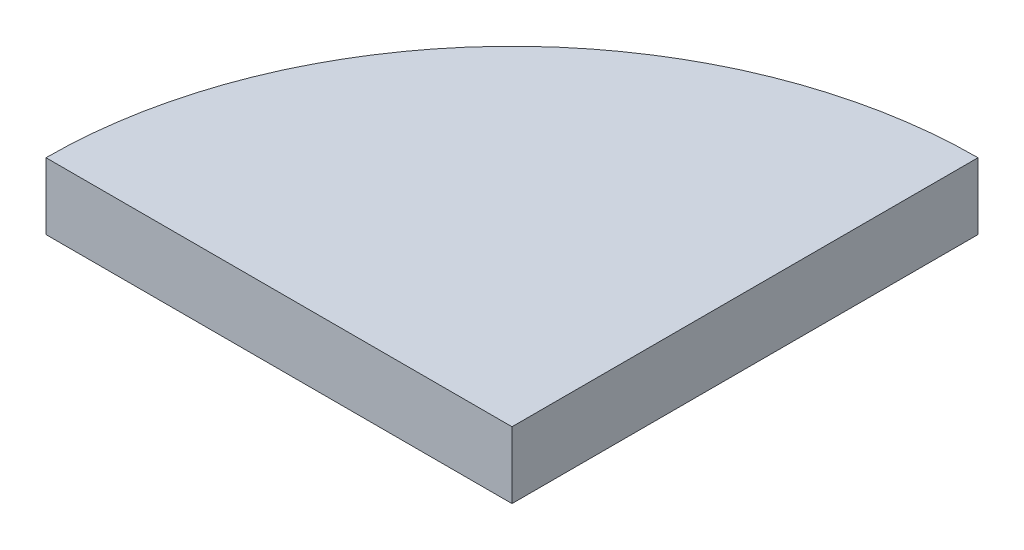
ISO-10303-21;
HEADER;
FILE_DESCRIPTION(('STEP AP214'),'2;1');
FILE_NAME('part.step','',(''),(''),'','','');
FILE_SCHEMA(('AUTOMOTIVE_DESIGN { 1 0 10303 214 1 1 1 1 }'));
ENDSEC;
DATA;
#1=APPLICATION_CONTEXT('core data for automotive mechanical design processes');
#2=APPLICATION_PROTOCOL_DEFINITION('international standard','automotive_design',2000,#1);
#3=PRODUCT_CONTEXT('',#1,'mechanical');
#4=PRODUCT('Part','Part','',(#3));
#5=PRODUCT_RELATED_PRODUCT_CATEGORY('part','',(#4));
#6=PRODUCT_DEFINITION_FORMATION('','',#4);
#7=PRODUCT_DEFINITION_CONTEXT('part definition',#1,'design');
#8=PRODUCT_DEFINITION('design','',#6,#7);
#9=PRODUCT_DEFINITION_SHAPE('','',#8);
#10=(LENGTH_UNIT() NAMED_UNIT(*) SI_UNIT(.MILLI.,.METRE.));
#11=(NAMED_UNIT(*) PLANE_ANGLE_UNIT() SI_UNIT($,.RADIAN.));
#12=(NAMED_UNIT(*) SI_UNIT($,.STERADIAN.) SOLID_ANGLE_UNIT());
#13=UNCERTAINTY_MEASURE_WITH_UNIT(LENGTH_MEASURE(1.E-05),#10,'distance_accuracy_value','');
#14=(GEOMETRIC_REPRESENTATION_CONTEXT(3) GLOBAL_UNCERTAINTY_ASSIGNED_CONTEXT((#13)) GLOBAL_UNIT_ASSIGNED_CONTEXT((#10,
#11,#12)) REPRESENTATION_CONTEXT('',''));
#15=CARTESIAN_POINT('',(0.,0.,0.));
#16=DIRECTION('',(0.,0.,1.));
#17=DIRECTION('',(1.,0.,0.));
#18=AXIS2_PLACEMENT_3D('',#15,#16,#17);
#19=CARTESIAN_POINT('',(0.,10.,0.));
#20=DIRECTION('',(-1.,0.,0.));
#21=DIRECTION('',(0.,0.,1.));
#22=AXIS2_PLACEMENT_3D('',#19,#20,#21);
#23=PLANE('',#22);
#24=DIRECTION('',(0.,0.,-1.));
#25=VECTOR('',#24,1.);
#26=CARTESIAN_POINT('',(0.,0.,0.));
#27=LINE('',#26,#25);
#28=CARTESIAN_POINT('',(0.,0.,0.));
#29=VERTEX_POINT('',#28);
#30=CARTESIAN_POINT('',(0.,0.,-70.));
#31=VERTEX_POINT('',#30);
#32=EDGE_CURVE('E89',#29,#31,#27,.T.);
#33=ORIENTED_EDGE('',*,*,#32,.T.);
#34=DIRECTION('',(0.,-1.,0.));
#35=VECTOR('',#34,1.);
#36=CARTESIAN_POINT('',(0.,10.,-70.));
#37=LINE('',#36,#35);
#38=CARTESIAN_POINT('',(0.,10.,-70.));
#39=VERTEX_POINT('',#38);
#40=EDGE_CURVE('E11',#39,#31,#37,.T.);
#41=ORIENTED_EDGE('',*,*,#40,.F.);
#42=DIRECTION('',(0.,0.,-1.));
#43=VECTOR('',#42,1.);
#44=CARTESIAN_POINT('',(0.,10.,0.));
#45=LINE('',#44,#43);
#46=CARTESIAN_POINT('',(0.,10.,0.));
#47=VERTEX_POINT('',#46);
#48=EDGE_CURVE('E81',#47,#39,#45,.T.);
#49=ORIENTED_EDGE('',*,*,#48,.F.);
#50=DIRECTION('',(0.,-1.,0.));
#51=VECTOR('',#50,1.);
#52=CARTESIAN_POINT('',(0.,10.,0.));
#53=LINE('',#52,#51);
#54=EDGE_CURVE('E90',#47,#29,#53,.T.);
#55=ORIENTED_EDGE('',*,*,#54,.T.);
#56=EDGE_LOOP('',(#33,#41,#49,#55));
#57=FACE_BOUND('',#56,.T.);
#58=ADVANCED_FACE('F39',(#57),#23,.F.);
#59=CARTESIAN_POINT('',(0.,10.,0.));
#60=DIRECTION('',(0.,-1.,0.));
#61=DIRECTION('',(0.,0.,-1.));
#62=AXIS2_PLACEMENT_3D('',#59,#60,#61);
#63=CYLINDRICAL_SURFACE('',#62,70.);
#64=CARTESIAN_POINT('',(0.,0.,0.));
#65=DIRECTION('',(0.,1.,0.));
#66=DIRECTION('',(0.,0.,-1.));
#67=AXIS2_PLACEMENT_3D('',#64,#65,#66);
#68=CIRCLE('',#67,70.);
#69=CARTESIAN_POINT('',(-70.,0.,0.));
#70=VERTEX_POINT('',#69);
#71=EDGE_CURVE('E68',#31,#70,#68,.T.);
#72=ORIENTED_EDGE('',*,*,#71,.T.);
#73=DIRECTION('',(0.,-1.,0.));
#74=VECTOR('',#73,1.);
#75=CARTESIAN_POINT('',(-70.,10.,0.));
#76=LINE('',#75,#74);
#77=CARTESIAN_POINT('',(-70.,10.,0.));
#78=VERTEX_POINT('',#77);
#79=EDGE_CURVE('E48',#78,#70,#76,.T.);
#80=ORIENTED_EDGE('',*,*,#79,.F.);
#81=CARTESIAN_POINT('',(0.,10.,0.));
#82=DIRECTION('',(0.,1.,0.));
#83=DIRECTION('',(0.,0.,-1.));
#84=AXIS2_PLACEMENT_3D('',#81,#82,#83);
#85=CIRCLE('',#84,70.);
#86=EDGE_CURVE('E76',#39,#78,#85,.T.);
#87=ORIENTED_EDGE('',*,*,#86,.F.);
#88=ORIENTED_EDGE('',*,*,#40,.T.);
#89=EDGE_LOOP('',(#72,#80,#87,#88));
#90=FACE_BOUND('',#89,.T.);
#91=ADVANCED_FACE('F77',(#90),#63,.T.);
#92=CARTESIAN_POINT('',(-70.,10.,0.));
#93=DIRECTION('',(0.,0.,-1.));
#94=DIRECTION('',(-1.,0.,0.));
#95=AXIS2_PLACEMENT_3D('',#92,#93,#94);
#96=PLANE('',#95);
#97=DIRECTION('',(1.,0.,0.));
#98=VECTOR('',#97,1.);
#99=CARTESIAN_POINT('',(-70.,0.,0.));
#100=LINE('',#99,#98);
#101=EDGE_CURVE('E73',#70,#29,#100,.T.);
#102=ORIENTED_EDGE('',*,*,#101,.T.);
#103=ORIENTED_EDGE('',*,*,#54,.F.);
#104=DIRECTION('',(1.,0.,0.));
#105=VECTOR('',#104,1.);
#106=CARTESIAN_POINT('',(-70.,10.,0.));
#107=LINE('',#106,#105);
#108=EDGE_CURVE('E56',#78,#47,#107,.T.);
#109=ORIENTED_EDGE('',*,*,#108,.F.);
#110=ORIENTED_EDGE('',*,*,#79,.T.);
#111=EDGE_LOOP('',(#102,#103,#109,#110));
#112=FACE_BOUND('',#111,.T.);
#113=ADVANCED_FACE('F102',(#112),#96,.F.);
#114=CARTESIAN_POINT('',(0.,10.,0.));
#115=DIRECTION('',(0.,-1.,0.));
#116=DIRECTION('',(0.,0.,-1.));
#117=AXIS2_PLACEMENT_3D('',#114,#115,#116);
#118=PLANE('',#117);
#119=ORIENTED_EDGE('',*,*,#48,.T.);
#120=ORIENTED_EDGE('',*,*,#86,.T.);
#121=ORIENTED_EDGE('',*,*,#108,.T.);
#122=EDGE_LOOP('',(#119,#120,#121));
#123=FACE_BOUND('',#122,.T.);
#124=ADVANCED_FACE('F84',(#123),#118,.F.);
#125=CARTESIAN_POINT('',(0.,0.,0.));
#126=DIRECTION('',(0.,-1.,0.));
#127=DIRECTION('',(0.,0.,-1.));
#128=AXIS2_PLACEMENT_3D('',#125,#126,#127);
#129=PLANE('',#128);
#130=ORIENTED_EDGE('',*,*,#32,.F.);
#131=ORIENTED_EDGE('',*,*,#101,.F.);
#132=ORIENTED_EDGE('',*,*,#71,.F.);
#133=EDGE_LOOP('',(#130,#131,#132));
#134=FACE_BOUND('',#133,.T.);
#135=ADVANCED_FACE('F103',(#134),#129,.T.);
#136=CLOSED_SHELL('',(#58,#91,#113,#124,#135));
#137=MANIFOLD_SOLID_BREP('B2',#136);
#138=ADVANCED_BREP_SHAPE_REPRESENTATION('',(#18,#137),#14);
#139=SHAPE_DEFINITION_REPRESENTATION(#9,#138);
ENDSEC;
END-ISO-10303-21;
